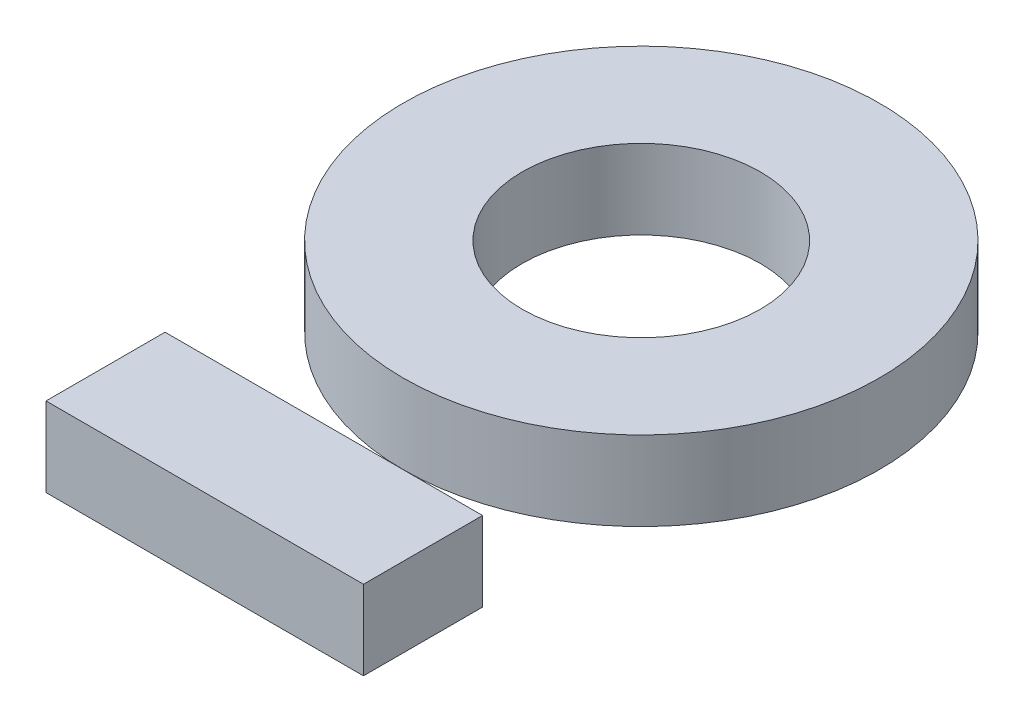
ISO-10303-21;
HEADER;
FILE_DESCRIPTION(('STEP AP214'),'2;1');
FILE_NAME('part.step','',(''),(''),'','','');
FILE_SCHEMA(('AUTOMOTIVE_DESIGN { 1 0 10303 214 1 1 1 1 }'));
ENDSEC;
DATA;
#1=APPLICATION_CONTEXT('core data for automotive mechanical design processes');
#2=APPLICATION_PROTOCOL_DEFINITION('international standard','automotive_design',2000,#1);
#3=PRODUCT_CONTEXT('',#1,'mechanical');
#4=PRODUCT('Part','Part','',(#3));
#5=PRODUCT_RELATED_PRODUCT_CATEGORY('part','',(#4));
#6=PRODUCT_DEFINITION_FORMATION('','',#4);
#7=PRODUCT_DEFINITION_CONTEXT('part definition',#1,'design');
#8=PRODUCT_DEFINITION('design','',#6,#7);
#9=PRODUCT_DEFINITION_SHAPE('','',#8);
#10=(LENGTH_UNIT() NAMED_UNIT(*) SI_UNIT(.MILLI.,.METRE.));
#11=(NAMED_UNIT(*) PLANE_ANGLE_UNIT() SI_UNIT($,.RADIAN.));
#12=(NAMED_UNIT(*) SI_UNIT($,.STERADIAN.) SOLID_ANGLE_UNIT());
#13=UNCERTAINTY_MEASURE_WITH_UNIT(LENGTH_MEASURE(1.E-05),#10,'distance_accuracy_value','');
#14=(GEOMETRIC_REPRESENTATION_CONTEXT(3) GLOBAL_UNCERTAINTY_ASSIGNED_CONTEXT((#13)) GLOBAL_UNIT_ASSIGNED_CONTEXT((#10,
#11,#12)) REPRESENTATION_CONTEXT('',''));
#15=CARTESIAN_POINT('',(0.,0.,0.));
#16=DIRECTION('',(0.,0.,1.));
#17=DIRECTION('',(1.,0.,0.));
#18=AXIS2_PLACEMENT_3D('',#15,#16,#17);
#19=CARTESIAN_POINT('',(-12.7,6.35,25.4));
#20=DIRECTION('',(1.,0.,0.));
#21=DIRECTION('',(0.,0.,-1.));
#22=AXIS2_PLACEMENT_3D('',#19,#20,#21);
#23=PLANE('',#22);
#24=DIRECTION('',(0.,0.,1.));
#25=VECTOR('',#24,1.);
#26=CARTESIAN_POINT('',(-12.7,0.,25.4));
#27=LINE('',#26,#25);
#28=CARTESIAN_POINT('',(-12.7,0.,25.4));
#29=VERTEX_POINT('',#28);
#30=CARTESIAN_POINT('',(-12.7,0.,34.925));
#31=VERTEX_POINT('',#30);
#32=EDGE_CURVE('E110',#29,#31,#27,.T.);
#33=ORIENTED_EDGE('',*,*,#32,.T.);
#34=DIRECTION('',(0.,-1.,0.));
#35=VECTOR('',#34,1.);
#36=CARTESIAN_POINT('',(-12.7,6.35,34.925));
#37=LINE('',#36,#35);
#38=CARTESIAN_POINT('',(-12.7,6.35,34.925));
#39=VERTEX_POINT('',#38);
#40=EDGE_CURVE('E12',#39,#31,#37,.T.);
#41=ORIENTED_EDGE('',*,*,#40,.F.);
#42=DIRECTION('',(0.,0.,1.));
#43=VECTOR('',#42,1.);
#44=CARTESIAN_POINT('',(-12.7,6.35,25.4));
#45=LINE('',#44,#43);
#46=CARTESIAN_POINT('',(-12.7,6.35,25.4));
#47=VERTEX_POINT('',#46);
#48=EDGE_CURVE('E98',#47,#39,#45,.T.);
#49=ORIENTED_EDGE('',*,*,#48,.F.);
#50=DIRECTION('',(0.,-1.,0.));
#51=VECTOR('',#50,1.);
#52=CARTESIAN_POINT('',(-12.7,6.35,25.4));
#53=LINE('',#52,#51);
#54=EDGE_CURVE('E106',#47,#29,#53,.T.);
#55=ORIENTED_EDGE('',*,*,#54,.T.);
#56=EDGE_LOOP('',(#33,#41,#49,#55));
#57=FACE_BOUND('',#56,.T.);
#58=ADVANCED_FACE('F47',(#57),#23,.F.);
#59=CARTESIAN_POINT('',(-12.7,6.35,34.925));
#60=DIRECTION('',(0.,0.,-1.));
#61=DIRECTION('',(-1.,0.,0.));
#62=AXIS2_PLACEMENT_3D('',#59,#60,#61);
#63=PLANE('',#62);
#64=DIRECTION('',(1.,0.,0.));
#65=VECTOR('',#64,1.);
#66=CARTESIAN_POINT('',(-12.7,0.,34.925));
#67=LINE('',#66,#65);
#68=CARTESIAN_POINT('',(12.7,0.,34.925));
#69=VERTEX_POINT('',#68);
#70=EDGE_CURVE('E102',#31,#69,#67,.T.);
#71=ORIENTED_EDGE('',*,*,#70,.T.);
#72=DIRECTION('',(0.,-1.,0.));
#73=VECTOR('',#72,1.);
#74=CARTESIAN_POINT('',(12.7,6.35,34.925));
#75=LINE('',#74,#73);
#76=CARTESIAN_POINT('',(12.7,6.35,34.925));
#77=VERTEX_POINT('',#76);
#78=EDGE_CURVE('E55',#77,#69,#75,.T.);
#79=ORIENTED_EDGE('',*,*,#78,.F.);
#80=DIRECTION('',(1.,0.,0.));
#81=VECTOR('',#80,1.);
#82=CARTESIAN_POINT('',(-12.7,6.35,34.925));
#83=LINE('',#82,#81);
#84=EDGE_CURVE('E93',#39,#77,#83,.T.);
#85=ORIENTED_EDGE('',*,*,#84,.F.);
#86=ORIENTED_EDGE('',*,*,#40,.T.);
#87=EDGE_LOOP('',(#71,#79,#85,#86));
#88=FACE_BOUND('',#87,.T.);
#89=ADVANCED_FACE('F101',(#88),#63,.F.);
#90=CARTESIAN_POINT('',(12.7,6.35,25.4));
#91=DIRECTION('',(-1.,0.,0.));
#92=DIRECTION('',(0.,0.,1.));
#93=AXIS2_PLACEMENT_3D('',#90,#91,#92);
#94=PLANE('',#93);
#95=DIRECTION('',(0.,0.,-1.));
#96=VECTOR('',#95,1.);
#97=CARTESIAN_POINT('',(12.7,0.,25.4));
#98=LINE('',#97,#96);
#99=CARTESIAN_POINT('',(12.7,0.,25.4));
#100=VERTEX_POINT('',#99);
#101=EDGE_CURVE('E80',#69,#100,#98,.T.);
#102=ORIENTED_EDGE('',*,*,#101,.T.);
#103=DIRECTION('',(0.,-1.,0.));
#104=VECTOR('',#103,1.);
#105=CARTESIAN_POINT('',(12.7,6.35,25.4));
#106=LINE('',#105,#104);
#107=CARTESIAN_POINT('',(12.7,6.35,25.4));
#108=VERTEX_POINT('',#107);
#109=EDGE_CURVE('E103',#108,#100,#106,.T.);
#110=ORIENTED_EDGE('',*,*,#109,.F.);
#111=DIRECTION('',(0.,0.,-1.));
#112=VECTOR('',#111,1.);
#113=CARTESIAN_POINT('',(12.7,6.35,25.4));
#114=LINE('',#113,#112);
#115=EDGE_CURVE('E96',#77,#108,#114,.T.);
#116=ORIENTED_EDGE('',*,*,#115,.F.);
#117=ORIENTED_EDGE('',*,*,#78,.T.);
#118=EDGE_LOOP('',(#102,#110,#116,#117));
#119=FACE_BOUND('',#118,.T.);
#120=ADVANCED_FACE('F104',(#119),#94,.F.);
#121=CARTESIAN_POINT('',(-12.7,6.35,25.4));
#122=DIRECTION('',(0.,0.,1.));
#123=DIRECTION('',(1.,0.,0.));
#124=AXIS2_PLACEMENT_3D('',#121,#122,#123);
#125=PLANE('',#124);
#126=DIRECTION('',(-1.,0.,0.));
#127=VECTOR('',#126,1.);
#128=CARTESIAN_POINT('',(-12.7,0.,25.4));
#129=LINE('',#128,#127);
#130=EDGE_CURVE('E86',#100,#29,#129,.T.);
#131=ORIENTED_EDGE('',*,*,#130,.T.);
#132=ORIENTED_EDGE('',*,*,#54,.F.);
#133=DIRECTION('',(-1.,0.,0.));
#134=VECTOR('',#133,1.);
#135=CARTESIAN_POINT('',(-12.7,6.35,25.4));
#136=LINE('',#135,#134);
#137=EDGE_CURVE('E63',#108,#47,#136,.T.);
#138=ORIENTED_EDGE('',*,*,#137,.F.);
#139=ORIENTED_EDGE('',*,*,#109,.T.);
#140=EDGE_LOOP('',(#131,#132,#138,#139));
#141=FACE_BOUND('',#140,.T.);
#142=ADVANCED_FACE('F117',(#141),#125,.F.);
#143=CARTESIAN_POINT('',(0.,6.35,0.));
#144=DIRECTION('',(0.,1.,0.));
#145=DIRECTION('',(0.,0.,1.));
#146=AXIS2_PLACEMENT_3D('',#143,#144,#145);
#147=PLANE('',#146);
#148=ORIENTED_EDGE('',*,*,#48,.T.);
#149=ORIENTED_EDGE('',*,*,#84,.T.);
#150=ORIENTED_EDGE('',*,*,#115,.T.);
#151=ORIENTED_EDGE('',*,*,#137,.T.);
#152=EDGE_LOOP('',(#148,#149,#150,#151));
#153=FACE_BOUND('',#152,.T.);
#154=ADVANCED_FACE('F94',(#153),#147,.T.);
#155=CARTESIAN_POINT('',(0.,0.,0.));
#156=DIRECTION('',(0.,1.,0.));
#157=DIRECTION('',(0.,0.,1.));
#158=AXIS2_PLACEMENT_3D('',#155,#156,#157);
#159=PLANE('',#158);
#160=ORIENTED_EDGE('',*,*,#32,.F.);
#161=ORIENTED_EDGE('',*,*,#130,.F.);
#162=ORIENTED_EDGE('',*,*,#101,.F.);
#163=ORIENTED_EDGE('',*,*,#70,.F.);
#164=EDGE_LOOP('',(#160,#161,#162,#163));
#165=FACE_BOUND('',#164,.T.);
#166=ADVANCED_FACE('F120',(#165),#159,.F.);
#167=CLOSED_SHELL('',(#58,#89,#120,#142,#154,#166));
#168=MANIFOLD_SOLID_BREP('B2',#167);
#169=CARTESIAN_POINT('',(0.,6.35,0.));
#170=DIRECTION('',(0.,1.,0.));
#171=DIRECTION('',(0.,0.,1.));
#172=AXIS2_PLACEMENT_3D('',#169,#170,#171);
#173=PLANE('',#172);
#174=CARTESIAN_POINT('',(0.,6.35,0.));
#175=DIRECTION('',(0.,1.,0.));
#176=DIRECTION('',(0.,0.,1.));
#177=AXIS2_PLACEMENT_3D('',#174,#175,#176);
#178=CIRCLE('',#177,19.05);
#179=CARTESIAN_POINT('',(0.,6.35,19.05));
#180=VERTEX_POINT('',#179);
#181=EDGE_CURVE('E46',#180,#180,#178,.T.);
#182=ORIENTED_EDGE('',*,*,#181,.T.);
#183=EDGE_LOOP('',(#182));
#184=FACE_BOUND('',#183,.T.);
#185=CARTESIAN_POINT('',(0.,6.35,0.));
#186=DIRECTION('',(0.,1.,0.));
#187=DIRECTION('',(0.,0.,1.));
#188=AXIS2_PLACEMENT_3D('',#185,#186,#187);
#189=CIRCLE('',#188,9.525);
#190=CARTESIAN_POINT('',(0.,6.35,9.525));
#191=VERTEX_POINT('',#190);
#192=EDGE_CURVE('E184',#191,#191,#189,.T.);
#193=ORIENTED_EDGE('',*,*,#192,.F.);
#194=EDGE_LOOP('',(#193));
#195=FACE_BOUND('',#194,.T.);
#196=ADVANCED_FACE('F171',(#184,#195),#173,.T.);
#197=CARTESIAN_POINT('',(0.,0.,0.));
#198=DIRECTION('',(0.,1.,0.));
#199=DIRECTION('',(0.,0.,1.));
#200=AXIS2_PLACEMENT_3D('',#197,#198,#199);
#201=PLANE('',#200);
#202=CARTESIAN_POINT('',(0.,0.,0.));
#203=DIRECTION('',(0.,1.,0.));
#204=DIRECTION('',(0.,0.,1.));
#205=AXIS2_PLACEMENT_3D('',#202,#203,#204);
#206=CIRCLE('',#205,19.05);
#207=CARTESIAN_POINT('',(0.,0.,19.05));
#208=VERTEX_POINT('',#207);
#209=EDGE_CURVE('E175',#208,#208,#206,.T.);
#210=ORIENTED_EDGE('',*,*,#209,.F.);
#211=EDGE_LOOP('',(#210));
#212=FACE_BOUND('',#211,.T.);
#213=CARTESIAN_POINT('',(0.,0.,0.));
#214=DIRECTION('',(0.,1.,0.));
#215=DIRECTION('',(0.,0.,1.));
#216=AXIS2_PLACEMENT_3D('',#213,#214,#215);
#217=CIRCLE('',#216,9.525);
#218=CARTESIAN_POINT('',(0.,0.,9.525));
#219=VERTEX_POINT('',#218);
#220=EDGE_CURVE('E186',#219,#219,#217,.T.);
#221=ORIENTED_EDGE('',*,*,#220,.T.);
#222=EDGE_LOOP('',(#221));
#223=FACE_BOUND('',#222,.T.);
#224=ADVANCED_FACE('F198',(#212,#223),#201,.F.);
#225=CARTESIAN_POINT('',(0.,6.35,0.));
#226=DIRECTION('',(0.,-1.,0.));
#227=DIRECTION('',(0.,0.,-1.));
#228=AXIS2_PLACEMENT_3D('',#225,#226,#227);
#229=CYLINDRICAL_SURFACE('',#228,19.05);
#230=ORIENTED_EDGE('',*,*,#181,.F.);
#231=EDGE_LOOP('',(#230));
#232=FACE_BOUND('',#231,.T.);
#233=ORIENTED_EDGE('',*,*,#209,.T.);
#234=EDGE_LOOP('',(#233));
#235=FACE_BOUND('',#234,.T.);
#236=ADVANCED_FACE('F173',(#232,#235),#229,.T.);
#237=CARTESIAN_POINT('',(0.,6.35,0.));
#238=DIRECTION('',(0.,-1.,0.));
#239=DIRECTION('',(0.,0.,-1.));
#240=AXIS2_PLACEMENT_3D('',#237,#238,#239);
#241=CYLINDRICAL_SURFACE('',#240,9.525);
#242=ORIENTED_EDGE('',*,*,#192,.T.);
#243=EDGE_LOOP('',(#242));
#244=FACE_BOUND('',#243,.T.);
#245=ORIENTED_EDGE('',*,*,#220,.F.);
#246=EDGE_LOOP('',(#245));
#247=FACE_BOUND('',#246,.T.);
#248=ADVANCED_FACE('F194',(#244,#247),#241,.F.);
#249=CLOSED_SHELL('',(#196,#224,#236,#248));
#250=MANIFOLD_SOLID_BREP('B6',#249);
#251=ADVANCED_BREP_SHAPE_REPRESENTATION('',(#18,#168,#250),#14);
#252=SHAPE_DEFINITION_REPRESENTATION(#9,#251);
ENDSEC;
END-ISO-10303-21;
